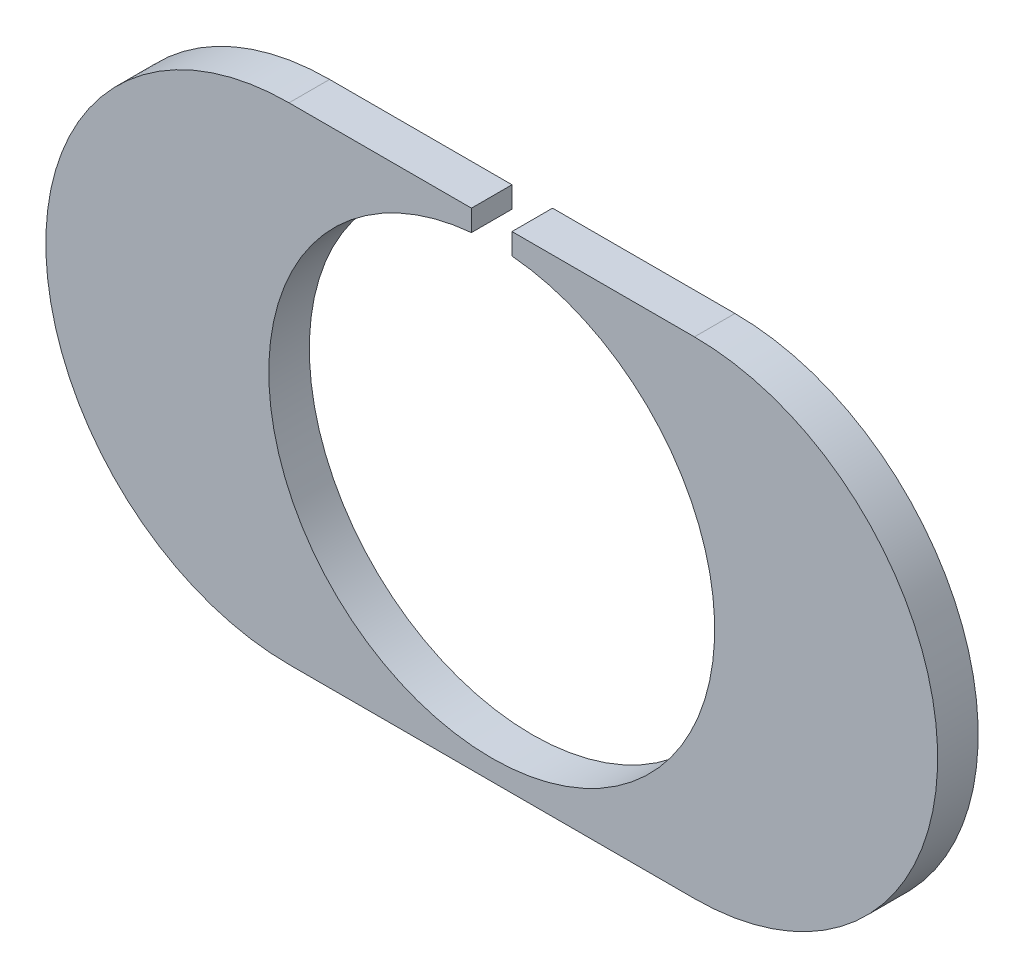
ISO-10303-21;
HEADER;
FILE_DESCRIPTION(('STEP AP214'),'2;1');
FILE_NAME('part.step','',(''),(''),'','','');
FILE_SCHEMA(('AUTOMOTIVE_DESIGN { 1 0 10303 214 1 1 1 1 }'));
ENDSEC;
DATA;
#1=APPLICATION_CONTEXT('core data for automotive mechanical design processes');
#2=APPLICATION_PROTOCOL_DEFINITION('international standard','automotive_design',2000,#1);
#3=PRODUCT_CONTEXT('',#1,'mechanical');
#4=PRODUCT('Part','Part','',(#3));
#5=PRODUCT_RELATED_PRODUCT_CATEGORY('part','',(#4));
#6=PRODUCT_DEFINITION_FORMATION('','',#4);
#7=PRODUCT_DEFINITION_CONTEXT('part definition',#1,'design');
#8=PRODUCT_DEFINITION('design','',#6,#7);
#9=PRODUCT_DEFINITION_SHAPE('','',#8);
#10=(LENGTH_UNIT() NAMED_UNIT(*) SI_UNIT(.MILLI.,.METRE.));
#11=(NAMED_UNIT(*) PLANE_ANGLE_UNIT() SI_UNIT($,.RADIAN.));
#12=(NAMED_UNIT(*) SI_UNIT($,.STERADIAN.) SOLID_ANGLE_UNIT());
#13=UNCERTAINTY_MEASURE_WITH_UNIT(LENGTH_MEASURE(1.E-05),#10,'distance_accuracy_value','');
#14=(GEOMETRIC_REPRESENTATION_CONTEXT(3) GLOBAL_UNCERTAINTY_ASSIGNED_CONTEXT((#13)) GLOBAL_UNIT_ASSIGNED_CONTEXT((#10,
#11,#12)) REPRESENTATION_CONTEXT('',''));
#15=CARTESIAN_POINT('',(0.,0.,0.));
#16=DIRECTION('',(0.,0.,1.));
#17=DIRECTION('',(1.,0.,0.));
#18=AXIS2_PLACEMENT_3D('',#15,#16,#17);
#19=CARTESIAN_POINT('',(-50.,60.,10.));
#20=DIRECTION('',(0.,-1.,0.));
#21=DIRECTION('',(1.,0.,0.));
#22=AXIS2_PLACEMENT_3D('',#19,#20,#21);
#23=PLANE('',#22);
#24=DIRECTION('',(-1.,0.,0.));
#25=VECTOR('',#24,1.);
#26=CARTESIAN_POINT('',(-50.,60.,10.));
#27=LINE('',#26,#25);
#28=CARTESIAN_POINT('',(-5.,60.,10.));
#29=VERTEX_POINT('',#28);
#30=CARTESIAN_POINT('',(-50.,60.,10.));
#31=VERTEX_POINT('',#30);
#32=EDGE_CURVE('E135',#29,#31,#27,.T.);
#33=ORIENTED_EDGE('',*,*,#32,.F.);
#34=DIRECTION('',(0.,0.,1.));
#35=VECTOR('',#34,1.);
#36=CARTESIAN_POINT('',(-5.,60.,-0.000999999999999265));
#37=LINE('',#36,#35);
#38=CARTESIAN_POINT('',(-5.,60.,0.));
#39=VERTEX_POINT('',#38);
#40=EDGE_CURVE('E122',#39,#29,#37,.T.);
#41=ORIENTED_EDGE('',*,*,#40,.F.);
#42=DIRECTION('',(-1.,0.,0.));
#43=VECTOR('',#42,1.);
#44=CARTESIAN_POINT('',(-50.,60.,0.));
#45=LINE('',#44,#43);
#46=CARTESIAN_POINT('',(-50.,60.,0.));
#47=VERTEX_POINT('',#46);
#48=EDGE_CURVE('E141',#39,#47,#45,.T.);
#49=ORIENTED_EDGE('',*,*,#48,.T.);
#50=DIRECTION('',(0.,0.,-1.));
#51=VECTOR('',#50,1.);
#52=CARTESIAN_POINT('',(-50.,60.,10.));
#53=LINE('',#52,#51);
#54=EDGE_CURVE('E136',#31,#47,#53,.T.);
#55=ORIENTED_EDGE('',*,*,#54,.F.);
#56=EDGE_LOOP('',(#33,#41,#49,#55));
#57=FACE_BOUND('',#56,.T.);
#58=ADVANCED_FACE('F33',(#57),#23,.F.);
#59=CARTESIAN_POINT('',(-50.,0.,10.));
#60=DIRECTION('',(0.,0.,1.));
#61=DIRECTION('',(1.,0.,0.));
#62=AXIS2_PLACEMENT_3D('',#59,#60,#61);
#63=PLANE('',#62);
#64=DIRECTION('',(0.,-1.,0.));
#65=VECTOR('',#64,1.);
#66=CARTESIAN_POINT('',(-5.,54.7722557505166,10.));
#67=LINE('',#66,#65);
#68=CARTESIAN_POINT('',(-4.99999999999998,54.7722557505166,10.));
#69=VERTEX_POINT('',#68);
#70=EDGE_CURVE('E56',#29,#69,#67,.T.);
#71=ORIENTED_EDGE('',*,*,#70,.F.);
#72=ORIENTED_EDGE('',*,*,#32,.T.);
#73=CARTESIAN_POINT('',(-50.,0.,10.));
#74=DIRECTION('',(0.,0.,1.));
#75=DIRECTION('',(1.,0.,0.));
#76=AXIS2_PLACEMENT_3D('',#73,#74,#75);
#77=CIRCLE('',#76,60.);
#78=CARTESIAN_POINT('',(-50.,-60.,10.));
#79=VERTEX_POINT('',#78);
#80=EDGE_CURVE('E127',#31,#79,#77,.T.);
#81=ORIENTED_EDGE('',*,*,#80,.T.);
#82=DIRECTION('',(1.,0.,0.));
#83=VECTOR('',#82,1.);
#84=CARTESIAN_POINT('',(-50.,-60.,10.));
#85=LINE('',#84,#83);
#86=CARTESIAN_POINT('',(50.,-60.,10.));
#87=VERTEX_POINT('',#86);
#88=EDGE_CURVE('E130',#79,#87,#85,.T.);
#89=ORIENTED_EDGE('',*,*,#88,.T.);
#90=CARTESIAN_POINT('',(50.,0.,10.));
#91=DIRECTION('',(0.,0.,1.));
#92=DIRECTION('',(1.,0.,0.));
#93=AXIS2_PLACEMENT_3D('',#90,#91,#92);
#94=CIRCLE('',#93,60.);
#95=CARTESIAN_POINT('',(50.,60.,10.));
#96=VERTEX_POINT('',#95);
#97=EDGE_CURVE('E133',#87,#96,#94,.T.);
#98=ORIENTED_EDGE('',*,*,#97,.T.);
#99=CARTESIAN_POINT('',(5.,60.,10.));
#100=VERTEX_POINT('',#99);
#101=EDGE_CURVE('E112',#96,#100,#27,.T.);
#102=ORIENTED_EDGE('',*,*,#101,.T.);
#103=DIRECTION('',(0.,1.,0.));
#104=VECTOR('',#103,1.);
#105=CARTESIAN_POINT('',(5.,54.7722557505166,10.));
#106=LINE('',#105,#104);
#107=CARTESIAN_POINT('',(5.,54.7722557505166,10.));
#108=VERTEX_POINT('',#107);
#109=EDGE_CURVE('E98',#108,#100,#106,.T.);
#110=ORIENTED_EDGE('',*,*,#109,.F.);
#111=CARTESIAN_POINT('',(0.,0.,10.));
#112=DIRECTION('',(0.,0.,1.));
#113=DIRECTION('',(1.,0.,0.));
#114=AXIS2_PLACEMENT_3D('',#111,#112,#113);
#115=CIRCLE('',#114,55.);
#116=EDGE_CURVE('E110',#69,#108,#115,.T.);
#117=ORIENTED_EDGE('',*,*,#116,.F.);
#118=EDGE_LOOP('',(#71,#72,#81,#89,#98,#102,#110,#117));
#119=FACE_BOUND('',#118,.T.);
#120=ADVANCED_FACE('F109',(#119),#63,.T.);
#121=CARTESIAN_POINT('',(-50.,0.,0.));
#122=DIRECTION('',(0.,0.,1.));
#123=DIRECTION('',(1.,0.,0.));
#124=AXIS2_PLACEMENT_3D('',#121,#122,#123);
#125=PLANE('',#124);
#126=ORIENTED_EDGE('',*,*,#48,.F.);
#127=DIRECTION('',(0.,1.,0.));
#128=VECTOR('',#127,1.);
#129=CARTESIAN_POINT('',(-5.,54.7722557505166,0.));
#130=LINE('',#129,#128);
#131=CARTESIAN_POINT('',(-5.,54.7722557505166,0.));
#132=VERTEX_POINT('',#131);
#133=EDGE_CURVE('E166',#132,#39,#130,.T.);
#134=ORIENTED_EDGE('',*,*,#133,.F.);
#135=CARTESIAN_POINT('',(0.,0.,0.));
#136=DIRECTION('',(0.,0.,1.));
#137=DIRECTION('',(1.,0.,0.));
#138=AXIS2_PLACEMENT_3D('',#135,#136,#137);
#139=CIRCLE('',#138,55.);
#140=CARTESIAN_POINT('',(5.,54.7722557505166,0.));
#141=VERTEX_POINT('',#140);
#142=EDGE_CURVE('E117',#132,#141,#139,.T.);
#143=ORIENTED_EDGE('',*,*,#142,.T.);
#144=DIRECTION('',(0.,-1.,0.));
#145=VECTOR('',#144,1.);
#146=CARTESIAN_POINT('',(5.,54.7722557505166,0.));
#147=LINE('',#146,#145);
#148=CARTESIAN_POINT('',(5.,60.,0.));
#149=VERTEX_POINT('',#148);
#150=EDGE_CURVE('E48',#149,#141,#147,.T.);
#151=ORIENTED_EDGE('',*,*,#150,.F.);
#152=CARTESIAN_POINT('',(50.,60.,0.));
#153=VERTEX_POINT('',#152);
#154=EDGE_CURVE('E131',#153,#149,#45,.T.);
#155=ORIENTED_EDGE('',*,*,#154,.F.);
#156=CARTESIAN_POINT('',(50.,0.,0.));
#157=DIRECTION('',(0.,0.,1.));
#158=DIRECTION('',(1.,0.,0.));
#159=AXIS2_PLACEMENT_3D('',#156,#157,#158);
#160=CIRCLE('',#159,60.);
#161=CARTESIAN_POINT('',(50.,-60.,0.));
#162=VERTEX_POINT('',#161);
#163=EDGE_CURVE('E139',#162,#153,#160,.T.);
#164=ORIENTED_EDGE('',*,*,#163,.F.);
#165=DIRECTION('',(1.,0.,0.));
#166=VECTOR('',#165,1.);
#167=CARTESIAN_POINT('',(-50.,-60.,0.));
#168=LINE('',#167,#166);
#169=CARTESIAN_POINT('',(-50.,-60.,0.));
#170=VERTEX_POINT('',#169);
#171=EDGE_CURVE('E120',#170,#162,#168,.T.);
#172=ORIENTED_EDGE('',*,*,#171,.F.);
#173=CARTESIAN_POINT('',(-50.,0.,0.));
#174=DIRECTION('',(0.,0.,1.));
#175=DIRECTION('',(1.,0.,0.));
#176=AXIS2_PLACEMENT_3D('',#173,#174,#175);
#177=CIRCLE('',#176,60.);
#178=EDGE_CURVE('E116',#47,#170,#177,.T.);
#179=ORIENTED_EDGE('',*,*,#178,.F.);
#180=EDGE_LOOP('',(#126,#134,#143,#151,#155,#164,#172,#179));
#181=FACE_BOUND('',#180,.T.);
#182=ADVANCED_FACE('F159',(#181),#125,.F.);
#183=CARTESIAN_POINT('',(-50.,0.,10.));
#184=DIRECTION('',(0.,0.,-1.));
#185=DIRECTION('',(-1.,0.,0.));
#186=AXIS2_PLACEMENT_3D('',#183,#184,#185);
#187=CYLINDRICAL_SURFACE('',#186,60.);
#188=ORIENTED_EDGE('',*,*,#178,.T.);
#189=DIRECTION('',(0.,0.,-1.));
#190=VECTOR('',#189,1.);
#191=CARTESIAN_POINT('',(-50.,-60.,10.));
#192=LINE('',#191,#190);
#193=EDGE_CURVE('E11',#79,#170,#192,.T.);
#194=ORIENTED_EDGE('',*,*,#193,.F.);
#195=ORIENTED_EDGE('',*,*,#80,.F.);
#196=ORIENTED_EDGE('',*,*,#54,.T.);
#197=EDGE_LOOP('',(#188,#194,#195,#196));
#198=FACE_BOUND('',#197,.T.);
#199=ADVANCED_FACE('F35',(#198),#187,.T.);
#200=CARTESIAN_POINT('',(-50.,-60.,10.));
#201=DIRECTION('',(0.,1.,0.));
#202=DIRECTION('',(-1.,0.,0.));
#203=AXIS2_PLACEMENT_3D('',#200,#201,#202);
#204=PLANE('',#203);
#205=ORIENTED_EDGE('',*,*,#171,.T.);
#206=DIRECTION('',(0.,0.,-1.));
#207=VECTOR('',#206,1.);
#208=CARTESIAN_POINT('',(50.,-60.,10.));
#209=LINE('',#208,#207);
#210=EDGE_CURVE('E41',#87,#162,#209,.T.);
#211=ORIENTED_EDGE('',*,*,#210,.F.);
#212=ORIENTED_EDGE('',*,*,#88,.F.);
#213=ORIENTED_EDGE('',*,*,#193,.T.);
#214=EDGE_LOOP('',(#205,#211,#212,#213));
#215=FACE_BOUND('',#214,.T.);
#216=ADVANCED_FACE('F177',(#215),#204,.F.);
#217=CARTESIAN_POINT('',(50.,0.,10.));
#218=DIRECTION('',(0.,0.,-1.));
#219=DIRECTION('',(-1.,0.,0.));
#220=AXIS2_PLACEMENT_3D('',#217,#218,#219);
#221=CYLINDRICAL_SURFACE('',#220,60.);
#222=ORIENTED_EDGE('',*,*,#163,.T.);
#223=DIRECTION('',(0.,0.,-1.));
#224=VECTOR('',#223,1.);
#225=CARTESIAN_POINT('',(50.,60.,10.));
#226=LINE('',#225,#224);
#227=EDGE_CURVE('E146',#96,#153,#226,.T.);
#228=ORIENTED_EDGE('',*,*,#227,.F.);
#229=ORIENTED_EDGE('',*,*,#97,.F.);
#230=ORIENTED_EDGE('',*,*,#210,.T.);
#231=EDGE_LOOP('',(#222,#228,#229,#230));
#232=FACE_BOUND('',#231,.T.);
#233=ADVANCED_FACE('F153',(#232),#221,.T.);
#234=ORIENTED_EDGE('',*,*,#154,.T.);
#235=DIRECTION('',(0.,0.,1.));
#236=VECTOR('',#235,1.);
#237=CARTESIAN_POINT('',(5.,60.,-0.000999999999999265));
#238=LINE('',#237,#236);
#239=EDGE_CURVE('E113',#149,#100,#238,.T.);
#240=ORIENTED_EDGE('',*,*,#239,.T.);
#241=ORIENTED_EDGE('',*,*,#101,.F.);
#242=ORIENTED_EDGE('',*,*,#227,.T.);
#243=EDGE_LOOP('',(#234,#240,#241,#242));
#244=FACE_BOUND('',#243,.T.);
#245=ADVANCED_FACE('F162',(#244),#23,.F.);
#246=CARTESIAN_POINT('',(0.,0.,10.));
#247=DIRECTION('',(0.,0.,-1.));
#248=DIRECTION('',(-1.,0.,0.));
#249=AXIS2_PLACEMENT_3D('',#246,#247,#248);
#250=CYLINDRICAL_SURFACE('',#249,55.);
#251=DIRECTION('',(0.,0.,-1.));
#252=VECTOR('',#251,1.);
#253=CARTESIAN_POINT('',(-4.99999999999998,54.7722557505166,10.));
#254=LINE('',#253,#252);
#255=EDGE_CURVE('E104',#132,#69,#254,.F.);
#256=ORIENTED_EDGE('',*,*,#255,.T.);
#257=ORIENTED_EDGE('',*,*,#116,.T.);
#258=DIRECTION('',(0.,0.,-1.));
#259=VECTOR('',#258,1.);
#260=CARTESIAN_POINT('',(4.99999999999998,54.7722557505166,10.));
#261=LINE('',#260,#259);
#262=EDGE_CURVE('E95',#108,#141,#261,.T.);
#263=ORIENTED_EDGE('',*,*,#262,.T.);
#264=ORIENTED_EDGE('',*,*,#142,.F.);
#265=EDGE_LOOP('',(#256,#257,#263,#264));
#266=FACE_BOUND('',#265,.T.);
#267=ADVANCED_FACE('F115',(#266),#250,.F.);
#268=CARTESIAN_POINT('',(5.,54.7722557505166,-0.000999999999999265));
#269=DIRECTION('',(1.,0.,0.));
#270=DIRECTION('',(0.,1.,0.));
#271=AXIS2_PLACEMENT_3D('',#268,#269,#270);
#272=PLANE('',#271);
#273=ORIENTED_EDGE('',*,*,#150,.T.);
#274=ORIENTED_EDGE('',*,*,#262,.F.);
#275=ORIENTED_EDGE('',*,*,#109,.T.);
#276=ORIENTED_EDGE('',*,*,#239,.F.);
#277=EDGE_LOOP('',(#273,#274,#275,#276));
#278=FACE_BOUND('',#277,.T.);
#279=ADVANCED_FACE('F97',(#278),#272,.F.);
#280=CARTESIAN_POINT('',(-5.,54.7722557505166,-0.000999999999999265));
#281=DIRECTION('',(-1.,0.,0.));
#282=DIRECTION('',(0.,0.,1.));
#283=AXIS2_PLACEMENT_3D('',#280,#281,#282);
#284=PLANE('',#283);
#285=ORIENTED_EDGE('',*,*,#133,.T.);
#286=ORIENTED_EDGE('',*,*,#40,.T.);
#287=ORIENTED_EDGE('',*,*,#70,.T.);
#288=ORIENTED_EDGE('',*,*,#255,.F.);
#289=EDGE_LOOP('',(#285,#286,#287,#288));
#290=FACE_BOUND('',#289,.T.);
#291=ADVANCED_FACE('F170',(#290),#284,.F.);
#292=CLOSED_SHELL('',(#58,#120,#182,#199,#216,#233,#245,#267,#279,#291));
#293=MANIFOLD_SOLID_BREP('B2',#292);
#294=ADVANCED_BREP_SHAPE_REPRESENTATION('',(#18,#293),#14);
#295=SHAPE_DEFINITION_REPRESENTATION(#9,#294);
ENDSEC;
END-ISO-10303-21;
